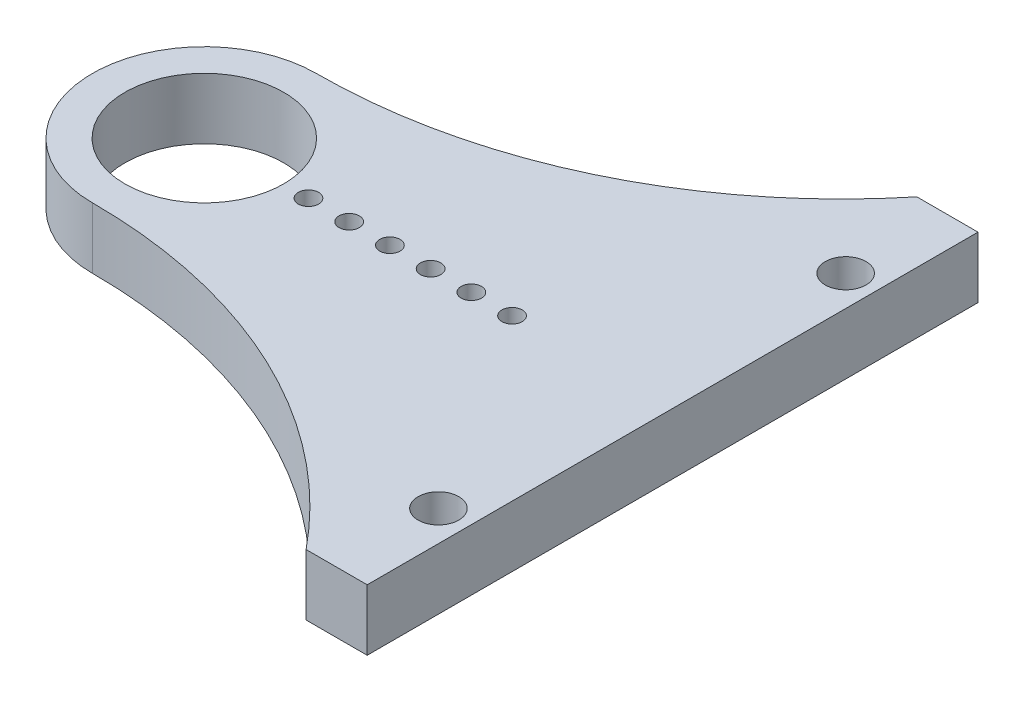
ISO-10303-21;
HEADER;
FILE_DESCRIPTION(('STEP AP214'),'2;1');
FILE_NAME('part.step','',(''),(''),'','','');
FILE_SCHEMA(('AUTOMOTIVE_DESIGN { 1 0 10303 214 1 1 1 1 }'));
ENDSEC;
DATA;
#1=APPLICATION_CONTEXT('core data for automotive mechanical design processes');
#2=APPLICATION_PROTOCOL_DEFINITION('international standard','automotive_design',2000,#1);
#3=PRODUCT_CONTEXT('',#1,'mechanical');
#4=PRODUCT('Part','Part','',(#3));
#5=PRODUCT_RELATED_PRODUCT_CATEGORY('part','',(#4));
#6=PRODUCT_DEFINITION_FORMATION('','',#4);
#7=PRODUCT_DEFINITION_CONTEXT('part definition',#1,'design');
#8=PRODUCT_DEFINITION('design','',#6,#7);
#9=PRODUCT_DEFINITION_SHAPE('','',#8);
#10=(LENGTH_UNIT() NAMED_UNIT(*) SI_UNIT(.MILLI.,.METRE.));
#11=(NAMED_UNIT(*) PLANE_ANGLE_UNIT() SI_UNIT($,.RADIAN.));
#12=(NAMED_UNIT(*) SI_UNIT($,.STERADIAN.) SOLID_ANGLE_UNIT());
#13=UNCERTAINTY_MEASURE_WITH_UNIT(LENGTH_MEASURE(1.E-05),#10,'distance_accuracy_value','');
#14=(GEOMETRIC_REPRESENTATION_CONTEXT(3) GLOBAL_UNCERTAINTY_ASSIGNED_CONTEXT((#13)) GLOBAL_UNIT_ASSIGNED_CONTEXT((#10,
#11,#12)) REPRESENTATION_CONTEXT('',''));
#15=CARTESIAN_POINT('',(0.,0.,0.));
#16=DIRECTION('',(0.,0.,1.));
#17=DIRECTION('',(1.,0.,0.));
#18=AXIS2_PLACEMENT_3D('',#15,#16,#17);
#19=CARTESIAN_POINT('',(-2.47207416556724,-3.,-43.7925349235222));
#20=DIRECTION('',(0.0563599445727848,0.,0.998410515092741));
#21=DIRECTION('',(0.998410515092741,0.,-0.0563599445727848));
#22=AXIS2_PLACEMENT_3D('',#19,#20,#21);
#23=PLANE('',#22);
#24=DIRECTION('',(-0.998410515092741,0.,0.0563599445727911));
#25=VECTOR('',#24,1.);
#26=CARTESIAN_POINT('',(-2.47207416556754,-1.5,-43.7925349235224));
#27=LINE('',#26,#25);
#28=CARTESIAN_POINT('',(-31.023874876301,-1.5,-42.1807951820186));
#29=VERTEX_POINT('',#28);
#30=CARTESIAN_POINT('',(-43.42430155987,-1.5,-41.4807951820186));
#31=VERTEX_POINT('',#30);
#32=EDGE_CURVE('E53',#29,#31,#27,.T.);
#33=ORIENTED_EDGE('',*,*,#32,.F.);
#34=DIRECTION('',(0.,1.,0.));
#35=VECTOR('',#34,1.);
#36=CARTESIAN_POINT('',(-31.023874876301,-3.,-42.1807951820186));
#37=LINE('',#36,#35);
#38=CARTESIAN_POINT('',(-31.023874876301,-3.,-42.1807951820186));
#39=VERTEX_POINT('',#38);
#40=EDGE_CURVE('E43',#39,#29,#37,.T.);
#41=ORIENTED_EDGE('',*,*,#40,.F.);
#42=DIRECTION('',(0.998410515092741,0.,-0.0563599445727848));
#43=VECTOR('',#42,1.);
#44=CARTESIAN_POINT('',(-2.47207416556724,-3.,-43.7925349235222));
#45=LINE('',#44,#43);
#46=CARTESIAN_POINT('',(-43.42430155987,-3.,-41.4807951820186));
#47=VERTEX_POINT('',#46);
#48=EDGE_CURVE('E155',#47,#39,#45,.T.);
#49=ORIENTED_EDGE('',*,*,#48,.F.);
#50=DIRECTION('',(0.,1.,0.));
#51=VECTOR('',#50,1.);
#52=CARTESIAN_POINT('',(-43.42430155987,-3.,-41.4807951820186));
#53=LINE('',#52,#51);
#54=EDGE_CURVE('E11',#47,#31,#53,.T.);
#55=ORIENTED_EDGE('',*,*,#54,.T.);
#56=EDGE_LOOP('',(#33,#41,#49,#55));
#57=FACE_BOUND('',#56,.T.);
#58=ADVANCED_FACE('F34',(#57),#23,.F.);
#59=CARTESIAN_POINT('',(-31.1424191842922,-3.,-44.2807951820186));
#60=DIRECTION('',(0.,1.,0.));
#61=DIRECTION('',(0.,0.,1.));
#62=AXIS2_PLACEMENT_3D('',#59,#60,#61);
#63=CYLINDRICAL_SURFACE('',#62,2.10334323232257);
#64=ORIENTED_EDGE('',*,*,#40,.T.);
#65=CARTESIAN_POINT('',(-31.1424191842922,-1.5,-44.2807951820186));
#66=DIRECTION('',(0.,1.,0.));
#67=DIRECTION('',(0.,0.,1.));
#68=AXIS2_PLACEMENT_3D('',#65,#66,#67);
#69=CIRCLE('',#68,2.10334323232257);
#70=CARTESIAN_POINT('',(-31.023874876301,-1.5,-46.3807951820186));
#71=VERTEX_POINT('',#70);
#72=EDGE_CURVE('E482',#71,#29,#69,.F.);
#73=ORIENTED_EDGE('',*,*,#72,.F.);
#74=DIRECTION('',(0.,1.,0.));
#75=VECTOR('',#74,1.);
#76=CARTESIAN_POINT('',(-31.023874876301,-3.,-46.3807951820186));
#77=LINE('',#76,#75);
#78=CARTESIAN_POINT('',(-31.023874876301,-3.,-46.3807951820186));
#79=VERTEX_POINT('',#78);
#80=EDGE_CURVE('E186',#79,#71,#77,.T.);
#81=ORIENTED_EDGE('',*,*,#80,.F.);
#82=CARTESIAN_POINT('',(-31.1424191842922,-3.,-44.2807951820186));
#83=DIRECTION('',(0.,1.,0.));
#84=DIRECTION('',(0.,0.,1.));
#85=AXIS2_PLACEMENT_3D('',#82,#83,#84);
#86=CIRCLE('',#85,2.10334323232257);
#87=EDGE_CURVE('E152',#79,#39,#86,.F.);
#88=ORIENTED_EDGE('',*,*,#87,.T.);
#89=EDGE_LOOP('',(#64,#73,#81,#88));
#90=FACE_BOUND('',#89,.T.);
#91=ADVANCED_FACE('F226',(#90),#63,.F.);
#92=CARTESIAN_POINT('',(2.51131852076804,-3.,-44.4877445655386));
#93=DIRECTION('',(-0.0563599445727848,0.,0.998410515092741));
#94=DIRECTION('',(0.998410515092741,0.,0.0563599445727848));
#95=AXIS2_PLACEMENT_3D('',#92,#93,#94);
#96=PLANE('',#95);
#97=ORIENTED_EDGE('',*,*,#80,.T.);
#98=DIRECTION('',(0.998410515092741,0.,0.0563599445727911));
#99=VECTOR('',#98,1.);
#100=CARTESIAN_POINT('',(2.51131852076831,-1.5,-44.4877445655383));
#101=LINE('',#100,#99);
#102=CARTESIAN_POINT('',(-43.42430155987,-1.5,-47.0807951820185));
#103=VERTEX_POINT('',#102);
#104=EDGE_CURVE('E485',#103,#71,#101,.T.);
#105=ORIENTED_EDGE('',*,*,#104,.F.);
#106=DIRECTION('',(0.,1.,0.));
#107=VECTOR('',#106,1.);
#108=CARTESIAN_POINT('',(-43.42430155987,-3.,-47.0807951820185));
#109=LINE('',#108,#107);
#110=CARTESIAN_POINT('',(-43.42430155987,-3.,-47.0807951820185));
#111=VERTEX_POINT('',#110);
#112=EDGE_CURVE('E189',#111,#103,#109,.T.);
#113=ORIENTED_EDGE('',*,*,#112,.F.);
#114=DIRECTION('',(0.998410515092741,0.,0.0563599445727848));
#115=VECTOR('',#114,1.);
#116=CARTESIAN_POINT('',(2.51131852076804,-3.,-44.4877445655386));
#117=LINE('',#116,#115);
#118=EDGE_CURVE('E149',#111,#79,#117,.T.);
#119=ORIENTED_EDGE('',*,*,#118,.T.);
#120=EDGE_LOOP('',(#97,#105,#113,#119));
#121=FACE_BOUND('',#120,.T.);
#122=ADVANCED_FACE('F231',(#121),#96,.T.);
#123=CARTESIAN_POINT('',(-46.1390759519697,-3.,-44.2807951820186));
#124=DIRECTION('',(0.,1.,0.));
#125=DIRECTION('',(0.,0.,1.));
#126=AXIS2_PLACEMENT_3D('',#123,#124,#125);
#127=CYLINDRICAL_SURFACE('',#126,3.9);
#128=CARTESIAN_POINT('',(-46.1390759519697,0.,-44.2807951820186));
#129=DIRECTION('',(0.,1.,0.));
#130=DIRECTION('',(0.,0.,1.));
#131=AXIS2_PLACEMENT_3D('',#128,#129,#130);
#132=CIRCLE('',#131,3.9);
#133=CARTESIAN_POINT('',(-46.1390759519697,0.,-40.3807951820186));
#134=VERTEX_POINT('',#133);
#135=EDGE_CURVE('E177',#134,#134,#132,.T.);
#136=ORIENTED_EDGE('',*,*,#135,.T.);
#137=EDGE_LOOP('',(#136));
#138=FACE_BOUND('',#137,.T.);
#139=CARTESIAN_POINT('',(-46.1390759519697,-1.5,-44.2807951820186));
#140=DIRECTION('',(0.,1.,0.));
#141=DIRECTION('',(0.,0.,1.));
#142=AXIS2_PLACEMENT_3D('',#139,#140,#141);
#143=CIRCLE('',#142,3.9);
#144=EDGE_CURVE('E437',#31,#103,#143,.T.);
#145=ORIENTED_EDGE('',*,*,#144,.F.);
#146=ORIENTED_EDGE('',*,*,#54,.F.);
#147=CARTESIAN_POINT('',(-46.1390759519697,-3.,-44.2807951820186));
#148=DIRECTION('',(0.,1.,0.));
#149=DIRECTION('',(0.,0.,1.));
#150=AXIS2_PLACEMENT_3D('',#147,#148,#149);
#151=CIRCLE('',#150,3.9);
#152=EDGE_CURVE('E146',#111,#47,#151,.T.);
#153=ORIENTED_EDGE('',*,*,#152,.F.);
#154=ORIENTED_EDGE('',*,*,#112,.T.);
#155=EDGE_LOOP('',(#145,#146,#153,#154));
#156=FACE_BOUND('',#155,.T.);
#157=ADVANCED_FACE('F239',(#138,#156),#127,.F.);
#158=CARTESIAN_POINT('',(-46.1390759519697,-3.,-75.5834267609659));
#159=DIRECTION('',(0.,1.,0.));
#160=DIRECTION('',(0.,0.,1.));
#161=AXIS2_PLACEMENT_3D('',#158,#159,#160);
#162=CYLINDRICAL_SURFACE('',#161,25.8026315789474);
#163=CARTESIAN_POINT('',(-46.1390759519697,0.,-75.5834267609659));
#164=DIRECTION('',(0.,1.,0.));
#165=DIRECTION('',(0.,0.,1.));
#166=AXIS2_PLACEMENT_3D('',#163,#164,#165);
#167=CIRCLE('',#166,25.8026315789474);
#168=CARTESIAN_POINT('',(-46.1390759519697,0.,-49.7807951820186));
#169=VERTEX_POINT('',#168);
#170=CARTESIAN_POINT('',(-26.1390759519697,0.,-59.2807951820186));
#171=VERTEX_POINT('',#170);
#172=EDGE_CURVE('E162',#169,#171,#167,.T.);
#173=ORIENTED_EDGE('',*,*,#172,.T.);
#174=DIRECTION('',(0.,1.,0.));
#175=VECTOR('',#174,1.);
#176=CARTESIAN_POINT('',(-26.1390759519697,-3.,-59.2807951820186));
#177=LINE('',#176,#175);
#178=CARTESIAN_POINT('',(-26.1390759519697,-3.,-59.2807951820186));
#179=VERTEX_POINT('',#178);
#180=EDGE_CURVE('E125',#179,#171,#177,.T.);
#181=ORIENTED_EDGE('',*,*,#180,.F.);
#182=CARTESIAN_POINT('',(-46.1390759519697,-3.,-75.5834267609659));
#183=DIRECTION('',(0.,1.,0.));
#184=DIRECTION('',(0.,0.,1.));
#185=AXIS2_PLACEMENT_3D('',#182,#183,#184);
#186=CIRCLE('',#185,25.8026315789474);
#187=CARTESIAN_POINT('',(-46.1390759519697,-3.,-49.7807951820186));
#188=VERTEX_POINT('',#187);
#189=EDGE_CURVE('E123',#188,#179,#186,.T.);
#190=ORIENTED_EDGE('',*,*,#189,.F.);
#191=DIRECTION('',(0.,1.,0.));
#192=VECTOR('',#191,1.);
#193=CARTESIAN_POINT('',(-46.1390759519697,-3.,-49.7807951820186));
#194=LINE('',#193,#192);
#195=EDGE_CURVE('E38',#188,#169,#194,.T.);
#196=ORIENTED_EDGE('',*,*,#195,.T.);
#197=EDGE_LOOP('',(#173,#181,#190,#196));
#198=FACE_BOUND('',#197,.T.);
#199=ADVANCED_FACE('F36',(#198),#162,.F.);
#200=CARTESIAN_POINT('',(0.,-3.,-59.2807951820185));
#201=DIRECTION('',(0.,0.,1.));
#202=DIRECTION('',(1.,0.,0.));
#203=AXIS2_PLACEMENT_3D('',#200,#201,#202);
#204=PLANE('',#203);
#205=DIRECTION('',(1.,0.,0.));
#206=VECTOR('',#205,1.);
#207=CARTESIAN_POINT('',(0.,0.,-59.2807951820185));
#208=LINE('',#207,#206);
#209=CARTESIAN_POINT('',(-23.1390759519697,0.,-59.2807951820186));
#210=VERTEX_POINT('',#209);
#211=EDGE_CURVE('E175',#171,#210,#208,.T.);
#212=ORIENTED_EDGE('',*,*,#211,.T.);
#213=DIRECTION('',(0.,1.,0.));
#214=VECTOR('',#213,1.);
#215=CARTESIAN_POINT('',(-23.1390759519697,-3.,-59.2807951820186));
#216=LINE('',#215,#214);
#217=CARTESIAN_POINT('',(-23.1390759519697,-3.,-59.2807951820186));
#218=VERTEX_POINT('',#217);
#219=EDGE_CURVE('E193',#218,#210,#216,.T.);
#220=ORIENTED_EDGE('',*,*,#219,.F.);
#221=DIRECTION('',(1.,0.,0.));
#222=VECTOR('',#221,1.);
#223=CARTESIAN_POINT('',(0.,-3.,-59.2807951820185));
#224=LINE('',#223,#222);
#225=EDGE_CURVE('E144',#179,#218,#224,.T.);
#226=ORIENTED_EDGE('',*,*,#225,.F.);
#227=ORIENTED_EDGE('',*,*,#180,.T.);
#228=EDGE_LOOP('',(#212,#220,#226,#227));
#229=FACE_BOUND('',#228,.T.);
#230=ADVANCED_FACE('F209',(#229),#204,.F.);
#231=CARTESIAN_POINT('',(-23.1390759519697,-3.,0.));
#232=DIRECTION('',(-1.,0.,0.));
#233=DIRECTION('',(0.,0.,1.));
#234=AXIS2_PLACEMENT_3D('',#231,#232,#233);
#235=PLANE('',#234);
#236=DIRECTION('',(0.,0.,1.));
#237=VECTOR('',#236,1.);
#238=CARTESIAN_POINT('',(-23.1390759519697,0.,0.));
#239=LINE('',#238,#237);
#240=CARTESIAN_POINT('',(-23.1390759519697,0.,-29.2807951820186));
#241=VERTEX_POINT('',#240);
#242=EDGE_CURVE('E172',#210,#241,#239,.T.);
#243=ORIENTED_EDGE('',*,*,#242,.T.);
#244=DIRECTION('',(0.,1.,0.));
#245=VECTOR('',#244,1.);
#246=CARTESIAN_POINT('',(-23.1390759519697,-3.,-29.2807951820186));
#247=LINE('',#246,#245);
#248=CARTESIAN_POINT('',(-23.1390759519697,-3.,-29.2807951820186));
#249=VERTEX_POINT('',#248);
#250=EDGE_CURVE('E196',#249,#241,#247,.T.);
#251=ORIENTED_EDGE('',*,*,#250,.F.);
#252=DIRECTION('',(0.,0.,1.));
#253=VECTOR('',#252,1.);
#254=CARTESIAN_POINT('',(-23.1390759519697,-3.,0.));
#255=LINE('',#254,#253);
#256=EDGE_CURVE('E142',#218,#249,#255,.T.);
#257=ORIENTED_EDGE('',*,*,#256,.F.);
#258=ORIENTED_EDGE('',*,*,#219,.T.);
#259=EDGE_LOOP('',(#243,#251,#257,#258));
#260=FACE_BOUND('',#259,.T.);
#261=ADVANCED_FACE('F213',(#260),#235,.F.);
#262=CARTESIAN_POINT('',(0.,-3.,-29.2807951820186));
#263=DIRECTION('',(0.,0.,1.));
#264=DIRECTION('',(1.,0.,0.));
#265=AXIS2_PLACEMENT_3D('',#262,#263,#264);
#266=PLANE('',#265);
#267=DIRECTION('',(1.,0.,0.));
#268=VECTOR('',#267,1.);
#269=CARTESIAN_POINT('',(0.,0.,-29.2807951820186));
#270=LINE('',#269,#268);
#271=CARTESIAN_POINT('',(-26.1390759519697,0.,-29.2807951820186));
#272=VERTEX_POINT('',#271);
#273=EDGE_CURVE('E169',#272,#241,#270,.T.);
#274=ORIENTED_EDGE('',*,*,#273,.F.);
#275=DIRECTION('',(0.,1.,0.));
#276=VECTOR('',#275,1.);
#277=CARTESIAN_POINT('',(-26.1390759519697,-3.,-29.2807951820186));
#278=LINE('',#277,#276);
#279=CARTESIAN_POINT('',(-26.1390759519697,-3.,-29.2807951820186));
#280=VERTEX_POINT('',#279);
#281=EDGE_CURVE('E198',#280,#272,#278,.T.);
#282=ORIENTED_EDGE('',*,*,#281,.F.);
#283=DIRECTION('',(1.,0.,0.));
#284=VECTOR('',#283,1.);
#285=CARTESIAN_POINT('',(0.,-3.,-29.2807951820186));
#286=LINE('',#285,#284);
#287=EDGE_CURVE('E136',#280,#249,#286,.T.);
#288=ORIENTED_EDGE('',*,*,#287,.T.);
#289=ORIENTED_EDGE('',*,*,#250,.T.);
#290=EDGE_LOOP('',(#274,#282,#288,#289));
#291=FACE_BOUND('',#290,.T.);
#292=ADVANCED_FACE('F215',(#291),#266,.T.);
#293=CARTESIAN_POINT('',(-46.1390759519697,-3.,-12.9781636030712));
#294=DIRECTION('',(0.,1.,0.));
#295=DIRECTION('',(0.,0.,1.));
#296=AXIS2_PLACEMENT_3D('',#293,#294,#295);
#297=CYLINDRICAL_SURFACE('',#296,25.8026315789474);
#298=CARTESIAN_POINT('',(-46.1390759519697,0.,-12.9781636030712));
#299=DIRECTION('',(0.,1.,0.));
#300=DIRECTION('',(0.,0.,1.));
#301=AXIS2_PLACEMENT_3D('',#298,#299,#300);
#302=CIRCLE('',#301,25.8026315789474);
#303=CARTESIAN_POINT('',(-46.1390759519697,0.,-38.7807951820186));
#304=VERTEX_POINT('',#303);
#305=EDGE_CURVE('E166',#304,#272,#302,.F.);
#306=ORIENTED_EDGE('',*,*,#305,.F.);
#307=DIRECTION('',(0.,1.,0.));
#308=VECTOR('',#307,1.);
#309=CARTESIAN_POINT('',(-46.1390759519697,-3.,-38.7807951820186));
#310=LINE('',#309,#308);
#311=CARTESIAN_POINT('',(-46.1390759519697,-3.,-38.7807951820186));
#312=VERTEX_POINT('',#311);
#313=EDGE_CURVE('E119',#312,#304,#310,.T.);
#314=ORIENTED_EDGE('',*,*,#313,.F.);
#315=CARTESIAN_POINT('',(-46.1390759519697,-3.,-12.9781636030712));
#316=DIRECTION('',(0.,1.,0.));
#317=DIRECTION('',(0.,0.,1.));
#318=AXIS2_PLACEMENT_3D('',#315,#316,#317);
#319=CIRCLE('',#318,25.8026315789474);
#320=EDGE_CURVE('E134',#312,#280,#319,.F.);
#321=ORIENTED_EDGE('',*,*,#320,.T.);
#322=ORIENTED_EDGE('',*,*,#281,.T.);
#323=EDGE_LOOP('',(#306,#314,#321,#322));
#324=FACE_BOUND('',#323,.T.);
#325=ADVANCED_FACE('F201',(#324),#297,.F.);
#326=CARTESIAN_POINT('',(-24.6390759519697,-3.,-54.2807951820186));
#327=DIRECTION('',(0.,1.,0.));
#328=DIRECTION('',(0.,0.,1.));
#329=AXIS2_PLACEMENT_3D('',#326,#327,#328);
#330=CYLINDRICAL_SURFACE('',#329,1.);
#331=CARTESIAN_POINT('',(-24.6390759519697,-3.,-54.2807951820186));
#332=DIRECTION('',(0.,1.,0.));
#333=DIRECTION('',(0.,0.,1.));
#334=AXIS2_PLACEMENT_3D('',#331,#332,#333);
#335=CIRCLE('',#334,1.);
#336=CARTESIAN_POINT('',(-24.6390759519697,-3.,-53.2807951820186));
#337=VERTEX_POINT('',#336);
#338=EDGE_CURVE('E157',#337,#337,#335,.T.);
#339=ORIENTED_EDGE('',*,*,#338,.F.);
#340=EDGE_LOOP('',(#339));
#341=FACE_BOUND('',#340,.T.);
#342=CARTESIAN_POINT('',(-24.6390759519697,0.,-54.2807951820186));
#343=DIRECTION('',(0.,1.,0.));
#344=DIRECTION('',(0.,0.,1.));
#345=AXIS2_PLACEMENT_3D('',#342,#343,#344);
#346=CIRCLE('',#345,1.);
#347=CARTESIAN_POINT('',(-24.6390759519697,0.,-53.2807951820186));
#348=VERTEX_POINT('',#347);
#349=EDGE_CURVE('E180',#348,#348,#346,.T.);
#350=ORIENTED_EDGE('',*,*,#349,.T.);
#351=EDGE_LOOP('',(#350));
#352=FACE_BOUND('',#351,.T.);
#353=ADVANCED_FACE('F222',(#341,#352),#330,.F.);
#354=CARTESIAN_POINT('',(-46.1390759519697,-3.,-44.2807951820186));
#355=DIRECTION('',(0.,1.,0.));
#356=DIRECTION('',(0.,0.,1.));
#357=AXIS2_PLACEMENT_3D('',#354,#355,#356);
#358=CYLINDRICAL_SURFACE('',#357,5.5);
#359=CARTESIAN_POINT('',(-46.1390759519697,0.,-44.2807951820186));
#360=DIRECTION('',(0.,1.,0.));
#361=DIRECTION('',(0.,0.,1.));
#362=AXIS2_PLACEMENT_3D('',#359,#360,#361);
#363=CIRCLE('',#362,5.5);
#364=EDGE_CURVE('E115',#169,#304,#363,.T.);
#365=ORIENTED_EDGE('',*,*,#364,.F.);
#366=ORIENTED_EDGE('',*,*,#195,.F.);
#367=CARTESIAN_POINT('',(-46.1390759519697,-3.,-44.2807951820186));
#368=DIRECTION('',(0.,1.,0.));
#369=DIRECTION('',(0.,0.,1.));
#370=AXIS2_PLACEMENT_3D('',#367,#368,#369);
#371=CIRCLE('',#370,5.5);
#372=EDGE_CURVE('E113',#188,#312,#371,.T.);
#373=ORIENTED_EDGE('',*,*,#372,.T.);
#374=ORIENTED_EDGE('',*,*,#313,.T.);
#375=EDGE_LOOP('',(#365,#366,#373,#374));
#376=FACE_BOUND('',#375,.T.);
#377=ADVANCED_FACE('F111',(#376),#358,.T.);
#378=CARTESIAN_POINT('',(-24.6390759519697,-3.,-34.2807951820186));
#379=DIRECTION('',(0.,1.,0.));
#380=DIRECTION('',(0.,0.,1.));
#381=AXIS2_PLACEMENT_3D('',#378,#379,#380);
#382=CYLINDRICAL_SURFACE('',#381,1.);
#383=CARTESIAN_POINT('',(-24.6390759519697,-3.,-34.2807951820186));
#384=DIRECTION('',(0.,1.,0.));
#385=DIRECTION('',(0.,0.,1.));
#386=AXIS2_PLACEMENT_3D('',#383,#384,#385);
#387=CIRCLE('',#386,1.);
#388=CARTESIAN_POINT('',(-24.6390759519697,-3.,-33.2807951820186));
#389=VERTEX_POINT('',#388);
#390=EDGE_CURVE('E120',#389,#389,#387,.F.);
#391=ORIENTED_EDGE('',*,*,#390,.T.);
#392=EDGE_LOOP('',(#391));
#393=FACE_BOUND('',#392,.T.);
#394=CARTESIAN_POINT('',(-24.6390759519697,0.,-34.2807951820186));
#395=DIRECTION('',(0.,1.,0.));
#396=DIRECTION('',(0.,0.,1.));
#397=AXIS2_PLACEMENT_3D('',#394,#395,#396);
#398=CIRCLE('',#397,1.);
#399=CARTESIAN_POINT('',(-24.6390759519697,0.,-33.2807951820186));
#400=VERTEX_POINT('',#399);
#401=EDGE_CURVE('E127',#400,#400,#398,.F.);
#402=ORIENTED_EDGE('',*,*,#401,.F.);
#403=EDGE_LOOP('',(#402));
#404=FACE_BOUND('',#403,.T.);
#405=ADVANCED_FACE('F277',(#393,#404),#382,.F.);
#406=CARTESIAN_POINT('',(0.,-3.,0.));
#407=DIRECTION('',(0.,1.,0.));
#408=DIRECTION('',(0.,0.,1.));
#409=AXIS2_PLACEMENT_3D('',#406,#407,#408);
#410=PLANE('',#409);
#411=ORIENTED_EDGE('',*,*,#189,.T.);
#412=ORIENTED_EDGE('',*,*,#225,.T.);
#413=ORIENTED_EDGE('',*,*,#256,.T.);
#414=ORIENTED_EDGE('',*,*,#287,.F.);
#415=ORIENTED_EDGE('',*,*,#320,.F.);
#416=ORIENTED_EDGE('',*,*,#372,.F.);
#417=EDGE_LOOP('',(#411,#412,#413,#414,#415,#416));
#418=FACE_BOUND('',#417,.T.);
#419=ORIENTED_EDGE('',*,*,#152,.T.);
#420=ORIENTED_EDGE('',*,*,#48,.T.);
#421=ORIENTED_EDGE('',*,*,#87,.F.);
#422=ORIENTED_EDGE('',*,*,#118,.F.);
#423=EDGE_LOOP('',(#419,#420,#421,#422));
#424=FACE_BOUND('',#423,.T.);
#425=ORIENTED_EDGE('',*,*,#338,.T.);
#426=EDGE_LOOP('',(#425));
#427=FACE_BOUND('',#426,.T.);
#428=ORIENTED_EDGE('',*,*,#390,.F.);
#429=EDGE_LOOP('',(#428));
#430=FACE_BOUND('',#429,.T.);
#431=ADVANCED_FACE('F130',(#418,#424,#427,#430),#410,.F.);
#432=CARTESIAN_POINT('',(0.,0.,0.));
#433=DIRECTION('',(0.,1.,0.));
#434=DIRECTION('',(0.,0.,1.));
#435=AXIS2_PLACEMENT_3D('',#432,#433,#434);
#436=PLANE('',#435);
#437=ORIENTED_EDGE('',*,*,#172,.F.);
#438=ORIENTED_EDGE('',*,*,#364,.T.);
#439=ORIENTED_EDGE('',*,*,#305,.T.);
#440=ORIENTED_EDGE('',*,*,#273,.T.);
#441=ORIENTED_EDGE('',*,*,#242,.F.);
#442=ORIENTED_EDGE('',*,*,#211,.F.);
#443=EDGE_LOOP('',(#437,#438,#439,#440,#441,#442));
#444=FACE_BOUND('',#443,.T.);
#445=ORIENTED_EDGE('',*,*,#135,.F.);
#446=EDGE_LOOP('',(#445));
#447=FACE_BOUND('',#446,.T.);
#448=ORIENTED_EDGE('',*,*,#349,.F.);
#449=EDGE_LOOP('',(#448));
#450=FACE_BOUND('',#449,.T.);
#451=ORIENTED_EDGE('',*,*,#401,.T.);
#452=EDGE_LOOP('',(#451));
#453=FACE_BOUND('',#452,.T.);
#454=CARTESIAN_POINT('',(-41.023874876301,0.,-44.2807951820185));
#455=DIRECTION('',(0.,1.,0.));
#456=DIRECTION('',(0.,0.,1.));
#457=AXIS2_PLACEMENT_3D('',#454,#455,#456);
#458=CIRCLE('',#457,0.499999999999999);
#459=CARTESIAN_POINT('',(-41.023874876301,0.,-43.7807951820185));
#460=VERTEX_POINT('',#459);
#461=EDGE_CURVE('E460',#460,#460,#458,.T.);
#462=ORIENTED_EDGE('',*,*,#461,.F.);
#463=EDGE_LOOP('',(#462));
#464=FACE_BOUND('',#463,.T.);
#465=CARTESIAN_POINT('',(-39.023874876301,0.,-44.2807951820185));
#466=DIRECTION('',(0.,1.,0.));
#467=DIRECTION('',(0.,0.,1.));
#468=AXIS2_PLACEMENT_3D('',#465,#466,#467);
#469=CIRCLE('',#468,0.499999999999999);
#470=CARTESIAN_POINT('',(-39.023874876301,0.,-43.7807951820185));
#471=VERTEX_POINT('',#470);
#472=EDGE_CURVE('E463',#471,#471,#469,.T.);
#473=ORIENTED_EDGE('',*,*,#472,.F.);
#474=EDGE_LOOP('',(#473));
#475=FACE_BOUND('',#474,.T.);
#476=CARTESIAN_POINT('',(-37.023874876301,0.,-44.2807951820185));
#477=DIRECTION('',(0.,1.,0.));
#478=DIRECTION('',(0.,0.,1.));
#479=AXIS2_PLACEMENT_3D('',#476,#477,#478);
#480=CIRCLE('',#479,0.499999999999999);
#481=CARTESIAN_POINT('',(-37.023874876301,0.,-43.7807951820185));
#482=VERTEX_POINT('',#481);
#483=EDGE_CURVE('E466',#482,#482,#480,.T.);
#484=ORIENTED_EDGE('',*,*,#483,.F.);
#485=EDGE_LOOP('',(#484));
#486=FACE_BOUND('',#485,.T.);
#487=CARTESIAN_POINT('',(-35.023874876301,0.,-44.2807951820185));
#488=DIRECTION('',(0.,1.,0.));
#489=DIRECTION('',(0.,0.,1.));
#490=AXIS2_PLACEMENT_3D('',#487,#488,#489);
#491=CIRCLE('',#490,0.499999999999999);
#492=CARTESIAN_POINT('',(-35.023874876301,0.,-43.7807951820185));
#493=VERTEX_POINT('',#492);
#494=EDGE_CURVE('E469',#493,#493,#491,.T.);
#495=ORIENTED_EDGE('',*,*,#494,.F.);
#496=EDGE_LOOP('',(#495));
#497=FACE_BOUND('',#496,.T.);
#498=CARTESIAN_POINT('',(-33.023874876301,0.,-44.2807951820185));
#499=DIRECTION('',(0.,1.,0.));
#500=DIRECTION('',(0.,0.,1.));
#501=AXIS2_PLACEMENT_3D('',#498,#499,#500);
#502=CIRCLE('',#501,0.499999999999999);
#503=CARTESIAN_POINT('',(-33.023874876301,0.,-43.7807951820185));
#504=VERTEX_POINT('',#503);
#505=EDGE_CURVE('E472',#504,#504,#502,.T.);
#506=ORIENTED_EDGE('',*,*,#505,.F.);
#507=EDGE_LOOP('',(#506));
#508=FACE_BOUND('',#507,.T.);
#509=CARTESIAN_POINT('',(-31.023874876301,0.,-44.2807951820186));
#510=DIRECTION('',(0.,1.,0.));
#511=DIRECTION('',(0.,0.,1.));
#512=AXIS2_PLACEMENT_3D('',#509,#510,#511);
#513=CIRCLE('',#512,0.499999999999999);
#514=CARTESIAN_POINT('',(-31.023874876301,0.,-43.7807951820186));
#515=VERTEX_POINT('',#514);
#516=EDGE_CURVE('E474',#515,#515,#513,.T.);
#517=ORIENTED_EDGE('',*,*,#516,.F.);
#518=EDGE_LOOP('',(#517));
#519=FACE_BOUND('',#518,.T.);
#520=ADVANCED_FACE('F204',(#444,#447,#450,#453,#464,#475,#486,#497,#508,#519),#436,.T.);
#521=CARTESIAN_POINT('',(-33.023874876301,-1.5,-44.2807951820185));
#522=DIRECTION('',(0.,1.,0.));
#523=DIRECTION('',(0.,0.,1.));
#524=AXIS2_PLACEMENT_3D('',#521,#522,#523);
#525=CYLINDRICAL_SURFACE('',#524,0.499999999999999);
#526=CARTESIAN_POINT('',(-33.023874876301,-1.5,-44.2807951820185));
#527=DIRECTION('',(0.,1.,0.));
#528=DIRECTION('',(0.,0.,1.));
#529=AXIS2_PLACEMENT_3D('',#526,#527,#528);
#530=CIRCLE('',#529,0.499999999999999);
#531=CARTESIAN_POINT('',(-33.023874876301,-1.5,-43.7807951820185));
#532=VERTEX_POINT('',#531);
#533=EDGE_CURVE('E453',#532,#532,#530,.T.);
#534=ORIENTED_EDGE('',*,*,#533,.F.);
#535=EDGE_LOOP('',(#534));
#536=FACE_BOUND('',#535,.T.);
#537=ORIENTED_EDGE('',*,*,#505,.T.);
#538=EDGE_LOOP('',(#537));
#539=FACE_BOUND('',#538,.T.);
#540=ADVANCED_FACE('F347',(#536,#539),#525,.F.);
#541=CARTESIAN_POINT('',(-35.023874876301,-1.5,-44.2807951820185));
#542=DIRECTION('',(0.,1.,0.));
#543=DIRECTION('',(0.,0.,1.));
#544=AXIS2_PLACEMENT_3D('',#541,#542,#543);
#545=CYLINDRICAL_SURFACE('',#544,0.499999999999999);
#546=CARTESIAN_POINT('',(-35.023874876301,-1.5,-44.2807951820185));
#547=DIRECTION('',(0.,1.,0.));
#548=DIRECTION('',(0.,0.,1.));
#549=AXIS2_PLACEMENT_3D('',#546,#547,#548);
#550=CIRCLE('',#549,0.499999999999999);
#551=CARTESIAN_POINT('',(-35.023874876301,-1.5,-43.7807951820185));
#552=VERTEX_POINT('',#551);
#553=EDGE_CURVE('E449',#552,#552,#550,.T.);
#554=ORIENTED_EDGE('',*,*,#553,.F.);
#555=EDGE_LOOP('',(#554));
#556=FACE_BOUND('',#555,.T.);
#557=ORIENTED_EDGE('',*,*,#494,.T.);
#558=EDGE_LOOP('',(#557));
#559=FACE_BOUND('',#558,.T.);
#560=ADVANCED_FACE('F362',(#556,#559),#545,.F.);
#561=CARTESIAN_POINT('',(-37.023874876301,-1.5,-44.2807951820185));
#562=DIRECTION('',(0.,1.,0.));
#563=DIRECTION('',(0.,0.,1.));
#564=AXIS2_PLACEMENT_3D('',#561,#562,#563);
#565=CYLINDRICAL_SURFACE('',#564,0.499999999999999);
#566=CARTESIAN_POINT('',(-37.023874876301,-1.5,-44.2807951820185));
#567=DIRECTION('',(0.,1.,0.));
#568=DIRECTION('',(0.,0.,1.));
#569=AXIS2_PLACEMENT_3D('',#566,#567,#568);
#570=CIRCLE('',#569,0.499999999999999);
#571=CARTESIAN_POINT('',(-37.023874876301,-1.5,-43.7807951820185));
#572=VERTEX_POINT('',#571);
#573=EDGE_CURVE('E445',#572,#572,#570,.T.);
#574=ORIENTED_EDGE('',*,*,#573,.F.);
#575=EDGE_LOOP('',(#574));
#576=FACE_BOUND('',#575,.T.);
#577=ORIENTED_EDGE('',*,*,#483,.T.);
#578=EDGE_LOOP('',(#577));
#579=FACE_BOUND('',#578,.T.);
#580=ADVANCED_FACE('F371',(#576,#579),#565,.F.);
#581=CARTESIAN_POINT('',(-39.023874876301,-1.5,-44.2807951820185));
#582=DIRECTION('',(0.,1.,0.));
#583=DIRECTION('',(0.,0.,1.));
#584=AXIS2_PLACEMENT_3D('',#581,#582,#583);
#585=CYLINDRICAL_SURFACE('',#584,0.499999999999999);
#586=CARTESIAN_POINT('',(-39.023874876301,-1.5,-44.2807951820185));
#587=DIRECTION('',(0.,1.,0.));
#588=DIRECTION('',(0.,0.,1.));
#589=AXIS2_PLACEMENT_3D('',#586,#587,#588);
#590=CIRCLE('',#589,0.499999999999999);
#591=CARTESIAN_POINT('',(-39.023874876301,-1.5,-43.7807951820185));
#592=VERTEX_POINT('',#591);
#593=EDGE_CURVE('E441',#592,#592,#590,.T.);
#594=ORIENTED_EDGE('',*,*,#593,.F.);
#595=EDGE_LOOP('',(#594));
#596=FACE_BOUND('',#595,.T.);
#597=ORIENTED_EDGE('',*,*,#472,.T.);
#598=EDGE_LOOP('',(#597));
#599=FACE_BOUND('',#598,.T.);
#600=ADVANCED_FACE('F380',(#596,#599),#585,.F.);
#601=CARTESIAN_POINT('',(-41.023874876301,-1.5,-44.2807951820185));
#602=DIRECTION('',(0.,1.,0.));
#603=DIRECTION('',(0.,0.,1.));
#604=AXIS2_PLACEMENT_3D('',#601,#602,#603);
#605=CYLINDRICAL_SURFACE('',#604,0.499999999999999);
#606=CARTESIAN_POINT('',(-41.023874876301,-1.5,-44.2807951820185));
#607=DIRECTION('',(0.,1.,0.));
#608=DIRECTION('',(0.,0.,1.));
#609=AXIS2_PLACEMENT_3D('',#606,#607,#608);
#610=CIRCLE('',#609,0.499999999999999);
#611=CARTESIAN_POINT('',(-41.023874876301,-1.5,-43.7807951820185));
#612=VERTEX_POINT('',#611);
#613=EDGE_CURVE('E432',#612,#612,#610,.T.);
#614=ORIENTED_EDGE('',*,*,#613,.F.);
#615=EDGE_LOOP('',(#614));
#616=FACE_BOUND('',#615,.T.);
#617=ORIENTED_EDGE('',*,*,#461,.T.);
#618=EDGE_LOOP('',(#617));
#619=FACE_BOUND('',#618,.T.);
#620=ADVANCED_FACE('F389',(#616,#619),#605,.F.);
#621=CARTESIAN_POINT('',(-31.023874876301,-1.5,-44.2807951820186));
#622=DIRECTION('',(0.,1.,0.));
#623=DIRECTION('',(0.,0.,1.));
#624=AXIS2_PLACEMENT_3D('',#621,#622,#623);
#625=CYLINDRICAL_SURFACE('',#624,0.499999999999999);
#626=CARTESIAN_POINT('',(-31.023874876301,-1.5,-44.2807951820186));
#627=DIRECTION('',(0.,1.,0.));
#628=DIRECTION('',(0.,0.,1.));
#629=AXIS2_PLACEMENT_3D('',#626,#627,#628);
#630=CIRCLE('',#629,0.499999999999999);
#631=CARTESIAN_POINT('',(-31.023874876301,-1.5,-43.7807951820186));
#632=VERTEX_POINT('',#631);
#633=EDGE_CURVE('E164',#632,#632,#630,.T.);
#634=ORIENTED_EDGE('',*,*,#633,.F.);
#635=EDGE_LOOP('',(#634));
#636=FACE_BOUND('',#635,.T.);
#637=ORIENTED_EDGE('',*,*,#516,.T.);
#638=EDGE_LOOP('',(#637));
#639=FACE_BOUND('',#638,.T.);
#640=ADVANCED_FACE('F398',(#636,#639),#625,.F.);
#641=CARTESIAN_POINT('',(0.,-1.5,0.));
#642=DIRECTION('',(0.,1.,0.));
#643=DIRECTION('',(0.,0.,1.));
#644=AXIS2_PLACEMENT_3D('',#641,#642,#643);
#645=PLANE('',#644);
#646=ORIENTED_EDGE('',*,*,#613,.T.);
#647=EDGE_LOOP('',(#646));
#648=FACE_BOUND('',#647,.T.);
#649=ORIENTED_EDGE('',*,*,#144,.T.);
#650=ORIENTED_EDGE('',*,*,#104,.T.);
#651=ORIENTED_EDGE('',*,*,#72,.T.);
#652=ORIENTED_EDGE('',*,*,#32,.T.);
#653=EDGE_LOOP('',(#649,#650,#651,#652));
#654=FACE_BOUND('',#653,.T.);
#655=ORIENTED_EDGE('',*,*,#593,.T.);
#656=EDGE_LOOP('',(#655));
#657=FACE_BOUND('',#656,.T.);
#658=ORIENTED_EDGE('',*,*,#573,.T.);
#659=EDGE_LOOP('',(#658));
#660=FACE_BOUND('',#659,.T.);
#661=ORIENTED_EDGE('',*,*,#553,.T.);
#662=EDGE_LOOP('',(#661));
#663=FACE_BOUND('',#662,.T.);
#664=ORIENTED_EDGE('',*,*,#533,.T.);
#665=EDGE_LOOP('',(#664));
#666=FACE_BOUND('',#665,.T.);
#667=ORIENTED_EDGE('',*,*,#633,.T.);
#668=EDGE_LOOP('',(#667));
#669=FACE_BOUND('',#668,.T.);
#670=ADVANCED_FACE('F407',(#648,#654,#657,#660,#663,#666,#669),#645,.F.);
#671=CLOSED_SHELL('',(#58,#91,#122,#157,#199,#230,#261,#292,#325,#353,#377,#405,#431,#520,#540,
#560,#580,#600,#620,#640,#670));
#672=MANIFOLD_SOLID_BREP('B2',#671);
#673=ADVANCED_BREP_SHAPE_REPRESENTATION('',(#18,#672),#14);
#674=SHAPE_DEFINITION_REPRESENTATION(#9,#673);
ENDSEC;
END-ISO-10303-21;
